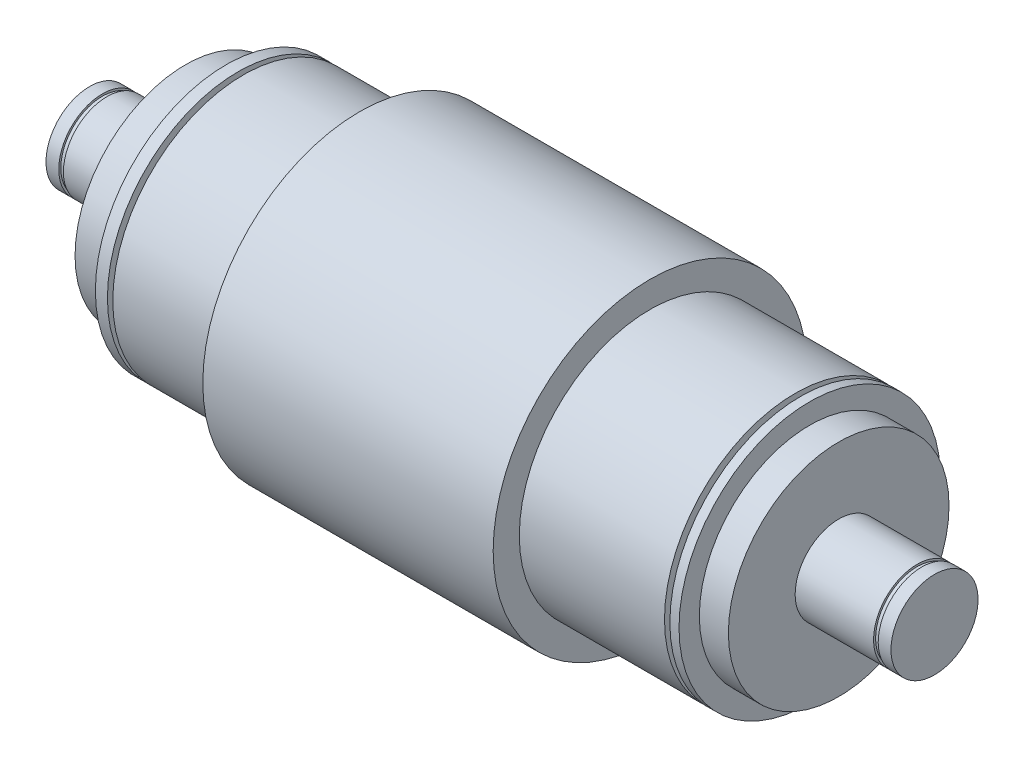
ISO-10303-21;
HEADER;
FILE_DESCRIPTION(('STEP AP214'),'2;1');
FILE_NAME('part.step','',(''),(''),'','','');
FILE_SCHEMA(('AUTOMOTIVE_DESIGN { 1 0 10303 214 1 1 1 1 }'));
ENDSEC;
DATA;
#1=APPLICATION_CONTEXT('core data for automotive mechanical design processes');
#2=APPLICATION_PROTOCOL_DEFINITION('international standard','automotive_design',2000,#1);
#3=PRODUCT_CONTEXT('',#1,'mechanical');
#4=PRODUCT('Part','Part','',(#3));
#5=PRODUCT_RELATED_PRODUCT_CATEGORY('part','',(#4));
#6=PRODUCT_DEFINITION_FORMATION('','',#4);
#7=PRODUCT_DEFINITION_CONTEXT('part definition',#1,'design');
#8=PRODUCT_DEFINITION('design','',#6,#7);
#9=PRODUCT_DEFINITION_SHAPE('','',#8);
#10=(LENGTH_UNIT() NAMED_UNIT(*) SI_UNIT(.MILLI.,.METRE.));
#11=(NAMED_UNIT(*) PLANE_ANGLE_UNIT() SI_UNIT($,.RADIAN.));
#12=(NAMED_UNIT(*) SI_UNIT($,.STERADIAN.) SOLID_ANGLE_UNIT());
#13=UNCERTAINTY_MEASURE_WITH_UNIT(LENGTH_MEASURE(1.E-05),#10,'distance_accuracy_value','');
#14=(GEOMETRIC_REPRESENTATION_CONTEXT(3) GLOBAL_UNCERTAINTY_ASSIGNED_CONTEXT((#13)) GLOBAL_UNIT_ASSIGNED_CONTEXT((#10,
#11,#12)) REPRESENTATION_CONTEXT('',''));
#15=CARTESIAN_POINT('',(0.,0.,0.));
#16=DIRECTION('',(0.,0.,1.));
#17=DIRECTION('',(1.,0.,0.));
#18=AXIS2_PLACEMENT_3D('',#15,#16,#17);
#19=CARTESIAN_POINT('',(0.,0.,0.));
#20=DIRECTION('',(-1.,0.,0.));
#21=DIRECTION('',(0.,0.,1.));
#22=AXIS2_PLACEMENT_3D('',#19,#20,#21);
#23=CYLINDRICAL_SURFACE('',#22,15.);
#24=CARTESIAN_POINT('',(33.,0.,0.));
#25=DIRECTION('',(-1.,0.,0.));
#26=DIRECTION('',(0.,0.,1.));
#27=AXIS2_PLACEMENT_3D('',#24,#25,#26);
#28=CIRCLE('',#27,15.);
#29=CARTESIAN_POINT('',(33.,0.,15.));
#30=VERTEX_POINT('',#29);
#31=EDGE_CURVE('E38',#30,#30,#28,.T.);
#32=ORIENTED_EDGE('',*,*,#31,.T.);
#33=EDGE_LOOP('',(#32));
#34=FACE_BOUND('',#33,.T.);
#35=CARTESIAN_POINT('',(6.,0.,0.));
#36=DIRECTION('',(-1.,0.,0.));
#37=DIRECTION('',(0.,0.,1.));
#38=AXIS2_PLACEMENT_3D('',#35,#36,#37);
#39=CIRCLE('',#38,15.);
#40=CARTESIAN_POINT('',(6.,0.,15.));
#41=VERTEX_POINT('',#40);
#42=EDGE_CURVE('E124',#41,#41,#39,.T.);
#43=ORIENTED_EDGE('',*,*,#42,.F.);
#44=EDGE_LOOP('',(#43));
#45=FACE_BOUND('',#44,.T.);
#46=ADVANCED_FACE('F31',(#34,#45),#23,.T.);
#47=CARTESIAN_POINT('',(0.,0.,0.));
#48=DIRECTION('',(-1.,0.,0.));
#49=DIRECTION('',(0.,0.,1.));
#50=AXIS2_PLACEMENT_3D('',#47,#48,#49);
#51=CYLINDRICAL_SURFACE('',#50,45.);
#52=CARTESIAN_POINT('',(47.,0.,0.));
#53=DIRECTION('',(-1.,0.,0.));
#54=DIRECTION('',(0.,0.,1.));
#55=AXIS2_PLACEMENT_3D('',#52,#53,#54);
#56=CIRCLE('',#55,45.);
#57=CARTESIAN_POINT('',(47.,0.,45.));
#58=VERTEX_POINT('',#57);
#59=EDGE_CURVE('E51',#58,#58,#56,.T.);
#60=ORIENTED_EDGE('',*,*,#59,.F.);
#61=EDGE_LOOP('',(#60));
#62=FACE_BOUND('',#61,.T.);
#63=CARTESIAN_POINT('',(51.15,0.,0.));
#64=DIRECTION('',(-1.,0.,0.));
#65=DIRECTION('',(0.,0.,1.));
#66=AXIS2_PLACEMENT_3D('',#63,#64,#65);
#67=CIRCLE('',#66,45.);
#68=CARTESIAN_POINT('',(51.15,0.,45.));
#69=VERTEX_POINT('',#68);
#70=EDGE_CURVE('E98',#69,#69,#67,.T.);
#71=ORIENTED_EDGE('',*,*,#70,.T.);
#72=EDGE_LOOP('',(#71));
#73=FACE_BOUND('',#72,.T.);
#74=ADVANCED_FACE('F149',(#62,#73),#51,.T.);
#75=CARTESIAN_POINT('',(33.,15.,0.));
#76=DIRECTION('',(1.,0.,0.));
#77=DIRECTION('',(0.,0.,-1.));
#78=AXIS2_PLACEMENT_3D('',#75,#76,#77);
#79=PLANE('',#78);
#80=ORIENTED_EDGE('',*,*,#31,.F.);
#81=EDGE_LOOP('',(#80));
#82=FACE_BOUND('',#81,.T.);
#83=CARTESIAN_POINT('',(33.,0.,0.));
#84=DIRECTION('',(-1.,0.,0.));
#85=DIRECTION('',(0.,0.,1.));
#86=AXIS2_PLACEMENT_3D('',#83,#84,#85);
#87=CIRCLE('',#86,38.);
#88=CARTESIAN_POINT('',(33.,0.,38.));
#89=VERTEX_POINT('',#88);
#90=EDGE_CURVE('E42',#89,#89,#87,.T.);
#91=ORIENTED_EDGE('',*,*,#90,.T.);
#92=EDGE_LOOP('',(#91));
#93=FACE_BOUND('',#92,.T.);
#94=ADVANCED_FACE('F153',(#82,#93),#79,.F.);
#95=CARTESIAN_POINT('',(0.,0.,0.));
#96=DIRECTION('',(-1.,0.,0.));
#97=DIRECTION('',(0.,0.,1.));
#98=AXIS2_PLACEMENT_3D('',#95,#96,#97);
#99=CYLINDRICAL_SURFACE('',#98,38.);
#100=ORIENTED_EDGE('',*,*,#90,.F.);
#101=EDGE_LOOP('',(#100));
#102=FACE_BOUND('',#101,.T.);
#103=CARTESIAN_POINT('',(47.,0.,0.));
#104=DIRECTION('',(-1.,0.,0.));
#105=DIRECTION('',(0.,0.,1.));
#106=AXIS2_PLACEMENT_3D('',#103,#104,#105);
#107=CIRCLE('',#106,38.);
#108=CARTESIAN_POINT('',(47.,0.,38.));
#109=VERTEX_POINT('',#108);
#110=EDGE_CURVE('E46',#109,#109,#107,.T.);
#111=ORIENTED_EDGE('',*,*,#110,.T.);
#112=EDGE_LOOP('',(#111));
#113=FACE_BOUND('',#112,.T.);
#114=ADVANCED_FACE('F316',(#102,#113),#99,.T.);
#115=CARTESIAN_POINT('',(47.,38.,0.));
#116=DIRECTION('',(1.,0.,0.));
#117=DIRECTION('',(0.,0.,-1.));
#118=AXIS2_PLACEMENT_3D('',#115,#116,#117);
#119=PLANE('',#118);
#120=ORIENTED_EDGE('',*,*,#110,.F.);
#121=EDGE_LOOP('',(#120));
#122=FACE_BOUND('',#121,.T.);
#123=ORIENTED_EDGE('',*,*,#59,.T.);
#124=EDGE_LOOP('',(#123));
#125=FACE_BOUND('',#124,.T.);
#126=ADVANCED_FACE('F213',(#122,#125),#119,.F.);
#127=CARTESIAN_POINT('',(51.15,45.,0.));
#128=DIRECTION('',(1.,0.,0.));
#129=DIRECTION('',(0.,0.,-1.));
#130=AXIS2_PLACEMENT_3D('',#127,#128,#129);
#131=PLANE('',#130);
#132=CARTESIAN_POINT('',(51.15,0.,0.));
#133=DIRECTION('',(-1.,0.,0.));
#134=DIRECTION('',(0.,0.,1.));
#135=AXIS2_PLACEMENT_3D('',#132,#133,#134);
#136=CIRCLE('',#135,21.25);
#137=CARTESIAN_POINT('',(51.15,0.,21.25));
#138=VERTEX_POINT('',#137);
#139=EDGE_CURVE('E107',#138,#138,#136,.T.);
#140=ORIENTED_EDGE('',*,*,#139,.T.);
#141=EDGE_LOOP('',(#140));
#142=FACE_BOUND('',#141,.T.);
#143=ORIENTED_EDGE('',*,*,#70,.F.);
#144=EDGE_LOOP('',(#143));
#145=FACE_BOUND('',#144,.T.);
#146=ADVANCED_FACE('F203',(#142,#145),#131,.T.);
#147=CARTESIAN_POINT('',(0.,0.,0.));
#148=DIRECTION('',(-1.,0.,0.));
#149=DIRECTION('',(0.,0.,1.));
#150=AXIS2_PLACEMENT_3D('',#147,#148,#149);
#151=CYLINDRICAL_SURFACE('',#150,21.25);
#152=CARTESIAN_POINT('',(53.,0.,0.));
#153=DIRECTION('',(-1.,0.,0.));
#154=DIRECTION('',(0.,0.,1.));
#155=AXIS2_PLACEMENT_3D('',#152,#153,#154);
#156=CIRCLE('',#155,21.25);
#157=CARTESIAN_POINT('',(53.,0.,21.25));
#158=VERTEX_POINT('',#157);
#159=EDGE_CURVE('E111',#158,#158,#156,.T.);
#160=ORIENTED_EDGE('',*,*,#159,.T.);
#161=EDGE_LOOP('',(#160));
#162=FACE_BOUND('',#161,.T.);
#163=ORIENTED_EDGE('',*,*,#139,.F.);
#164=EDGE_LOOP('',(#163));
#165=FACE_BOUND('',#164,.T.);
#166=ADVANCED_FACE('F145',(#162,#165),#151,.T.);
#167=CARTESIAN_POINT('',(53.,45.,0.));
#168=DIRECTION('',(-1.,0.,0.));
#169=DIRECTION('',(0.,0.,1.));
#170=AXIS2_PLACEMENT_3D('',#167,#168,#169);
#171=PLANE('',#170);
#172=CARTESIAN_POINT('',(53.,0.,0.));
#173=DIRECTION('',(-1.,0.,0.));
#174=DIRECTION('',(0.,0.,1.));
#175=AXIS2_PLACEMENT_3D('',#172,#173,#174);
#176=CIRCLE('',#175,45.);
#177=CARTESIAN_POINT('',(53.,0.,45.));
#178=VERTEX_POINT('',#177);
#179=EDGE_CURVE('E114',#178,#178,#176,.T.);
#180=ORIENTED_EDGE('',*,*,#179,.T.);
#181=EDGE_LOOP('',(#180));
#182=FACE_BOUND('',#181,.T.);
#183=ORIENTED_EDGE('',*,*,#159,.F.);
#184=EDGE_LOOP('',(#183));
#185=FACE_BOUND('',#184,.T.);
#186=ADVANCED_FACE('F135',(#182,#185),#171,.T.);
#187=CARTESIAN_POINT('',(4.4,15.,0.));
#188=DIRECTION('',(1.,0.,0.));
#189=DIRECTION('',(0.,0.,-1.));
#190=AXIS2_PLACEMENT_3D('',#187,#188,#189);
#191=PLANE('',#190);
#192=CARTESIAN_POINT('',(4.4,0.,0.));
#193=DIRECTION('',(-1.,0.,0.));
#194=DIRECTION('',(0.,0.,1.));
#195=AXIS2_PLACEMENT_3D('',#192,#193,#194);
#196=CIRCLE('',#195,14.3);
#197=CARTESIAN_POINT('',(4.4,0.,14.3));
#198=VERTEX_POINT('',#197);
#199=EDGE_CURVE('E81',#198,#198,#196,.T.);
#200=ORIENTED_EDGE('',*,*,#199,.T.);
#201=EDGE_LOOP('',(#200));
#202=FACE_BOUND('',#201,.T.);
#203=CARTESIAN_POINT('',(4.4,0.,0.));
#204=DIRECTION('',(-1.,0.,0.));
#205=DIRECTION('',(0.,0.,1.));
#206=AXIS2_PLACEMENT_3D('',#203,#204,#205);
#207=CIRCLE('',#206,15.);
#208=CARTESIAN_POINT('',(4.4,0.,15.));
#209=VERTEX_POINT('',#208);
#210=EDGE_CURVE('E110',#209,#209,#207,.T.);
#211=ORIENTED_EDGE('',*,*,#210,.F.);
#212=EDGE_LOOP('',(#211));
#213=FACE_BOUND('',#212,.T.);
#214=ADVANCED_FACE('F132',(#202,#213),#191,.T.);
#215=CARTESIAN_POINT('',(0.,0.,0.));
#216=DIRECTION('',(-1.,0.,0.));
#217=DIRECTION('',(0.,0.,1.));
#218=AXIS2_PLACEMENT_3D('',#215,#216,#217);
#219=CYLINDRICAL_SURFACE('',#218,14.3);
#220=CARTESIAN_POINT('',(6.,0.,0.));
#221=DIRECTION('',(-1.,0.,0.));
#222=DIRECTION('',(0.,0.,1.));
#223=AXIS2_PLACEMENT_3D('',#220,#221,#222);
#224=CIRCLE('',#223,14.3);
#225=CARTESIAN_POINT('',(6.,0.,14.3));
#226=VERTEX_POINT('',#225);
#227=EDGE_CURVE('E121',#226,#226,#224,.T.);
#228=ORIENTED_EDGE('',*,*,#227,.T.);
#229=EDGE_LOOP('',(#228));
#230=FACE_BOUND('',#229,.T.);
#231=ORIENTED_EDGE('',*,*,#199,.F.);
#232=EDGE_LOOP('',(#231));
#233=FACE_BOUND('',#232,.T.);
#234=ADVANCED_FACE('F134',(#230,#233),#219,.T.);
#235=CARTESIAN_POINT('',(6.,15.,0.));
#236=DIRECTION('',(-1.,0.,0.));
#237=DIRECTION('',(0.,0.,1.));
#238=AXIS2_PLACEMENT_3D('',#235,#236,#237);
#239=PLANE('',#238);
#240=ORIENTED_EDGE('',*,*,#42,.T.);
#241=EDGE_LOOP('',(#240));
#242=FACE_BOUND('',#241,.T.);
#243=ORIENTED_EDGE('',*,*,#227,.F.);
#244=EDGE_LOOP('',(#243));
#245=FACE_BOUND('',#244,.T.);
#246=ADVANCED_FACE('F142',(#242,#245),#239,.T.);
#247=CARTESIAN_POINT('',(0.,0.,0.));
#248=DIRECTION('',(1.,0.,0.));
#249=DIRECTION('',(0.,0.,-1.));
#250=AXIS2_PLACEMENT_3D('',#247,#248,#249);
#251=PLANE('',#250);
#252=CARTESIAN_POINT('',(0.,0.,0.));
#253=DIRECTION('',(-1.,0.,0.));
#254=DIRECTION('',(0.,0.,1.));
#255=AXIS2_PLACEMENT_3D('',#252,#253,#254);
#256=CIRCLE('',#255,15.);
#257=CARTESIAN_POINT('',(0.,0.,15.));
#258=VERTEX_POINT('',#257);
#259=EDGE_CURVE('E10',#258,#258,#256,.T.);
#260=ORIENTED_EDGE('',*,*,#259,.T.);
#261=EDGE_LOOP('',(#260));
#262=FACE_BOUND('',#261,.T.);
#263=ADVANCED_FACE('F33',(#262),#251,.F.);
#264=ORIENTED_EDGE('',*,*,#259,.F.);
#265=EDGE_LOOP('',(#264));
#266=FACE_BOUND('',#265,.T.);
#267=ORIENTED_EDGE('',*,*,#210,.T.);
#268=EDGE_LOOP('',(#267));
#269=FACE_BOUND('',#268,.T.);
#270=ADVANCED_FACE('F130',(#266,#269),#23,.T.);
#271=CARTESIAN_POINT('',(93.,45.,0.));
#272=DIRECTION('',(1.,0.,0.));
#273=DIRECTION('',(0.,0.,-1.));
#274=AXIS2_PLACEMENT_3D('',#271,#272,#273);
#275=PLANE('',#274);
#276=CARTESIAN_POINT('',(93.,0.,0.));
#277=DIRECTION('',(-1.,0.,0.));
#278=DIRECTION('',(0.,0.,1.));
#279=AXIS2_PLACEMENT_3D('',#276,#277,#278);
#280=CIRCLE('',#279,45.);
#281=CARTESIAN_POINT('',(93.,0.,45.));
#282=VERTEX_POINT('',#281);
#283=EDGE_CURVE('E54',#282,#282,#280,.T.);
#284=ORIENTED_EDGE('',*,*,#283,.F.);
#285=EDGE_LOOP('',(#284));
#286=FACE_BOUND('',#285,.T.);
#287=CARTESIAN_POINT('',(93.,0.,0.));
#288=DIRECTION('',(-1.,0.,0.));
#289=DIRECTION('',(0.,0.,1.));
#290=AXIS2_PLACEMENT_3D('',#287,#288,#289);
#291=CIRCLE('',#290,54.);
#292=CARTESIAN_POINT('',(93.,0.,54.));
#293=VERTEX_POINT('',#292);
#294=EDGE_CURVE('E57',#293,#293,#291,.T.);
#295=ORIENTED_EDGE('',*,*,#294,.T.);
#296=EDGE_LOOP('',(#295));
#297=FACE_BOUND('',#296,.T.);
#298=ADVANCED_FACE('F160',(#286,#297),#275,.F.);
#299=ORIENTED_EDGE('',*,*,#283,.T.);
#300=EDGE_LOOP('',(#299));
#301=FACE_BOUND('',#300,.T.);
#302=ORIENTED_EDGE('',*,*,#179,.F.);
#303=EDGE_LOOP('',(#302));
#304=FACE_BOUND('',#303,.T.);
#305=ADVANCED_FACE('F156',(#301,#304),#51,.T.);
#306=CARTESIAN_POINT('',(0.,0.,0.));
#307=DIRECTION('',(-1.,0.,0.));
#308=DIRECTION('',(0.,0.,1.));
#309=AXIS2_PLACEMENT_3D('',#306,#307,#308);
#310=CYLINDRICAL_SURFACE('',#309,54.);
#311=ORIENTED_EDGE('',*,*,#294,.F.);
#312=EDGE_LOOP('',(#311));
#313=FACE_BOUND('',#312,.T.);
#314=CARTESIAN_POINT('',(193.,0.,0.));
#315=DIRECTION('',(-1.,0.,0.));
#316=DIRECTION('',(0.,0.,1.));
#317=AXIS2_PLACEMENT_3D('',#314,#315,#316);
#318=CIRCLE('',#317,54.);
#319=CARTESIAN_POINT('',(193.,0.,54.));
#320=VERTEX_POINT('',#319);
#321=EDGE_CURVE('E60',#320,#320,#318,.T.);
#322=ORIENTED_EDGE('',*,*,#321,.T.);
#323=EDGE_LOOP('',(#322));
#324=FACE_BOUND('',#323,.T.);
#325=ADVANCED_FACE('F290',(#313,#324),#310,.T.);
#326=CARTESIAN_POINT('',(193.,54.,0.));
#327=DIRECTION('',(-1.,0.,0.));
#328=DIRECTION('',(0.,0.,1.));
#329=AXIS2_PLACEMENT_3D('',#326,#327,#328);
#330=PLANE('',#329);
#331=ORIENTED_EDGE('',*,*,#321,.F.);
#332=EDGE_LOOP('',(#331));
#333=FACE_BOUND('',#332,.T.);
#334=CARTESIAN_POINT('',(193.,0.,0.));
#335=DIRECTION('',(-1.,0.,0.));
#336=DIRECTION('',(0.,0.,1.));
#337=AXIS2_PLACEMENT_3D('',#334,#335,#336);
#338=CIRCLE('',#337,45.);
#339=CARTESIAN_POINT('',(193.,0.,45.));
#340=VERTEX_POINT('',#339);
#341=EDGE_CURVE('E63',#340,#340,#338,.T.);
#342=ORIENTED_EDGE('',*,*,#341,.T.);
#343=EDGE_LOOP('',(#342));
#344=FACE_BOUND('',#343,.T.);
#345=ADVANCED_FACE('F285',(#333,#344),#330,.F.);
#346=CARTESIAN_POINT('',(0.,0.,0.));
#347=DIRECTION('',(-1.,0.,0.));
#348=DIRECTION('',(0.,0.,1.));
#349=AXIS2_PLACEMENT_3D('',#346,#347,#348);
#350=CYLINDRICAL_SURFACE('',#349,45.);
#351=ORIENTED_EDGE('',*,*,#341,.F.);
#352=EDGE_LOOP('',(#351));
#353=FACE_BOUND('',#352,.T.);
#354=CARTESIAN_POINT('',(243.,0.,0.));
#355=DIRECTION('',(-1.,0.,0.));
#356=DIRECTION('',(0.,0.,1.));
#357=AXIS2_PLACEMENT_3D('',#354,#355,#356);
#358=CIRCLE('',#357,45.);
#359=CARTESIAN_POINT('',(243.,0.,45.));
#360=VERTEX_POINT('',#359);
#361=EDGE_CURVE('E85',#360,#360,#358,.T.);
#362=ORIENTED_EDGE('',*,*,#361,.T.);
#363=EDGE_LOOP('',(#362));
#364=FACE_BOUND('',#363,.T.);
#365=ADVANCED_FACE('F289',(#353,#364),#350,.T.);
#366=CARTESIAN_POINT('',(243.,45.,0.));
#367=DIRECTION('',(1.,0.,0.));
#368=DIRECTION('',(0.,0.,-1.));
#369=AXIS2_PLACEMENT_3D('',#366,#367,#368);
#370=PLANE('',#369);
#371=CARTESIAN_POINT('',(243.,0.,0.));
#372=DIRECTION('',(-1.,0.,0.));
#373=DIRECTION('',(0.,0.,1.));
#374=AXIS2_PLACEMENT_3D('',#371,#372,#373);
#375=CIRCLE('',#374,21.25);
#376=CARTESIAN_POINT('',(243.,0.,21.25));
#377=VERTEX_POINT('',#376);
#378=EDGE_CURVE('E95',#377,#377,#375,.T.);
#379=ORIENTED_EDGE('',*,*,#378,.T.);
#380=EDGE_LOOP('',(#379));
#381=FACE_BOUND('',#380,.T.);
#382=ORIENTED_EDGE('',*,*,#361,.F.);
#383=EDGE_LOOP('',(#382));
#384=FACE_BOUND('',#383,.T.);
#385=ADVANCED_FACE('F343',(#381,#384),#370,.T.);
#386=CARTESIAN_POINT('',(0.,0.,0.));
#387=DIRECTION('',(-1.,0.,0.));
#388=DIRECTION('',(0.,0.,1.));
#389=AXIS2_PLACEMENT_3D('',#386,#387,#388);
#390=CYLINDRICAL_SURFACE('',#389,21.25);
#391=CARTESIAN_POINT('',(244.85,0.,0.));
#392=DIRECTION('',(-1.,0.,0.));
#393=DIRECTION('',(0.,0.,1.));
#394=AXIS2_PLACEMENT_3D('',#391,#392,#393);
#395=CIRCLE('',#394,21.25);
#396=CARTESIAN_POINT('',(244.85,0.,21.25));
#397=VERTEX_POINT('',#396);
#398=EDGE_CURVE('E99',#397,#397,#395,.T.);
#399=ORIENTED_EDGE('',*,*,#398,.T.);
#400=EDGE_LOOP('',(#399));
#401=FACE_BOUND('',#400,.T.);
#402=ORIENTED_EDGE('',*,*,#378,.F.);
#403=EDGE_LOOP('',(#402));
#404=FACE_BOUND('',#403,.T.);
#405=ADVANCED_FACE('F360',(#401,#404),#390,.T.);
#406=CARTESIAN_POINT('',(244.85,45.,0.));
#407=DIRECTION('',(-1.,0.,0.));
#408=DIRECTION('',(0.,0.,1.));
#409=AXIS2_PLACEMENT_3D('',#406,#407,#408);
#410=PLANE('',#409);
#411=CARTESIAN_POINT('',(244.85,0.,0.));
#412=DIRECTION('',(-1.,0.,0.));
#413=DIRECTION('',(0.,0.,1.));
#414=AXIS2_PLACEMENT_3D('',#411,#412,#413);
#415=CIRCLE('',#414,45.);
#416=CARTESIAN_POINT('',(244.85,0.,45.));
#417=VERTEX_POINT('',#416);
#418=EDGE_CURVE('E102',#417,#417,#415,.T.);
#419=ORIENTED_EDGE('',*,*,#418,.T.);
#420=EDGE_LOOP('',(#419));
#421=FACE_BOUND('',#420,.T.);
#422=ORIENTED_EDGE('',*,*,#398,.F.);
#423=EDGE_LOOP('',(#422));
#424=FACE_BOUND('',#423,.T.);
#425=ADVANCED_FACE('F277',(#421,#424),#410,.T.);
#426=CARTESIAN_POINT('',(248.,45.,0.));
#427=DIRECTION('',(-1.,0.,0.));
#428=DIRECTION('',(0.,0.,1.));
#429=AXIS2_PLACEMENT_3D('',#426,#427,#428);
#430=PLANE('',#429);
#431=CARTESIAN_POINT('',(248.,0.,0.));
#432=DIRECTION('',(-1.,0.,0.));
#433=DIRECTION('',(0.,0.,1.));
#434=AXIS2_PLACEMENT_3D('',#431,#432,#433);
#435=CIRCLE('',#434,45.);
#436=CARTESIAN_POINT('',(248.,0.,45.));
#437=VERTEX_POINT('',#436);
#438=EDGE_CURVE('E66',#437,#437,#435,.T.);
#439=ORIENTED_EDGE('',*,*,#438,.F.);
#440=EDGE_LOOP('',(#439));
#441=FACE_BOUND('',#440,.T.);
#442=CARTESIAN_POINT('',(248.,0.,0.));
#443=DIRECTION('',(-1.,0.,0.));
#444=DIRECTION('',(0.,0.,1.));
#445=AXIS2_PLACEMENT_3D('',#442,#443,#444);
#446=CIRCLE('',#445,38.);
#447=CARTESIAN_POINT('',(248.,0.,38.));
#448=VERTEX_POINT('',#447);
#449=EDGE_CURVE('E69',#448,#448,#446,.T.);
#450=ORIENTED_EDGE('',*,*,#449,.T.);
#451=EDGE_LOOP('',(#450));
#452=FACE_BOUND('',#451,.T.);
#453=ADVANCED_FACE('F273',(#441,#452),#430,.F.);
#454=ORIENTED_EDGE('',*,*,#438,.T.);
#455=EDGE_LOOP('',(#454));
#456=FACE_BOUND('',#455,.T.);
#457=ORIENTED_EDGE('',*,*,#418,.F.);
#458=EDGE_LOOP('',(#457));
#459=FACE_BOUND('',#458,.T.);
#460=ADVANCED_FACE('F265',(#456,#459),#350,.T.);
#461=CARTESIAN_POINT('',(0.,0.,0.));
#462=DIRECTION('',(-1.,0.,0.));
#463=DIRECTION('',(0.,0.,1.));
#464=AXIS2_PLACEMENT_3D('',#461,#462,#463);
#465=CYLINDRICAL_SURFACE('',#464,38.);
#466=ORIENTED_EDGE('',*,*,#449,.F.);
#467=EDGE_LOOP('',(#466));
#468=FACE_BOUND('',#467,.T.);
#469=CARTESIAN_POINT('',(258.,0.,0.));
#470=DIRECTION('',(-1.,0.,0.));
#471=DIRECTION('',(0.,0.,1.));
#472=AXIS2_PLACEMENT_3D('',#469,#470,#471);
#473=CIRCLE('',#472,38.);
#474=CARTESIAN_POINT('',(258.,0.,38.));
#475=VERTEX_POINT('',#474);
#476=EDGE_CURVE('E72',#475,#475,#473,.T.);
#477=ORIENTED_EDGE('',*,*,#476,.T.);
#478=EDGE_LOOP('',(#477));
#479=FACE_BOUND('',#478,.T.);
#480=ADVANCED_FACE('F254',(#468,#479),#465,.T.);
#481=CARTESIAN_POINT('',(258.,38.,0.));
#482=DIRECTION('',(-1.,0.,0.));
#483=DIRECTION('',(0.,0.,1.));
#484=AXIS2_PLACEMENT_3D('',#481,#482,#483);
#485=PLANE('',#484);
#486=ORIENTED_EDGE('',*,*,#476,.F.);
#487=EDGE_LOOP('',(#486));
#488=FACE_BOUND('',#487,.T.);
#489=CARTESIAN_POINT('',(258.,0.,0.));
#490=DIRECTION('',(-1.,0.,0.));
#491=DIRECTION('',(0.,0.,1.));
#492=AXIS2_PLACEMENT_3D('',#489,#490,#491);
#493=CIRCLE('',#492,15.);
#494=CARTESIAN_POINT('',(258.,0.,15.));
#495=VERTEX_POINT('',#494);
#496=EDGE_CURVE('E75',#495,#495,#493,.T.);
#497=ORIENTED_EDGE('',*,*,#496,.T.);
#498=EDGE_LOOP('',(#497));
#499=FACE_BOUND('',#498,.T.);
#500=ADVANCED_FACE('F249',(#488,#499),#485,.F.);
#501=CARTESIAN_POINT('',(0.,0.,0.));
#502=DIRECTION('',(-1.,0.,0.));
#503=DIRECTION('',(0.,0.,1.));
#504=AXIS2_PLACEMENT_3D('',#501,#502,#503);
#505=CYLINDRICAL_SURFACE('',#504,15.);
#506=ORIENTED_EDGE('',*,*,#496,.F.);
#507=EDGE_LOOP('',(#506));
#508=FACE_BOUND('',#507,.T.);
#509=CARTESIAN_POINT('',(285.,0.,0.));
#510=DIRECTION('',(-1.,0.,0.));
#511=DIRECTION('',(0.,0.,1.));
#512=AXIS2_PLACEMENT_3D('',#509,#510,#511);
#513=CIRCLE('',#512,15.);
#514=CARTESIAN_POINT('',(285.,0.,15.));
#515=VERTEX_POINT('',#514);
#516=EDGE_CURVE('E92',#515,#515,#513,.T.);
#517=ORIENTED_EDGE('',*,*,#516,.T.);
#518=EDGE_LOOP('',(#517));
#519=FACE_BOUND('',#518,.T.);
#520=ADVANCED_FACE('F253',(#508,#519),#505,.T.);
#521=CARTESIAN_POINT('',(285.,15.,0.));
#522=DIRECTION('',(1.,0.,0.));
#523=DIRECTION('',(0.,0.,-1.));
#524=AXIS2_PLACEMENT_3D('',#521,#522,#523);
#525=PLANE('',#524);
#526=CARTESIAN_POINT('',(285.,0.,0.));
#527=DIRECTION('',(-1.,0.,0.));
#528=DIRECTION('',(0.,0.,1.));
#529=AXIS2_PLACEMENT_3D('',#526,#527,#528);
#530=CIRCLE('',#529,14.3);
#531=CARTESIAN_POINT('',(285.,0.,14.3));
#532=VERTEX_POINT('',#531);
#533=EDGE_CURVE('E82',#532,#532,#530,.T.);
#534=ORIENTED_EDGE('',*,*,#533,.T.);
#535=EDGE_LOOP('',(#534));
#536=FACE_BOUND('',#535,.T.);
#537=ORIENTED_EDGE('',*,*,#516,.F.);
#538=EDGE_LOOP('',(#537));
#539=FACE_BOUND('',#538,.T.);
#540=ADVANCED_FACE('F346',(#536,#539),#525,.T.);
#541=CARTESIAN_POINT('',(0.,0.,0.));
#542=DIRECTION('',(-1.,0.,0.));
#543=DIRECTION('',(0.,0.,1.));
#544=AXIS2_PLACEMENT_3D('',#541,#542,#543);
#545=CYLINDRICAL_SURFACE('',#544,14.3);
#546=CARTESIAN_POINT('',(286.6,0.,0.));
#547=DIRECTION('',(-1.,0.,0.));
#548=DIRECTION('',(0.,0.,1.));
#549=AXIS2_PLACEMENT_3D('',#546,#547,#548);
#550=CIRCLE('',#549,14.3);
#551=CARTESIAN_POINT('',(286.6,0.,14.3));
#552=VERTEX_POINT('',#551);
#553=EDGE_CURVE('E86',#552,#552,#550,.T.);
#554=ORIENTED_EDGE('',*,*,#553,.T.);
#555=EDGE_LOOP('',(#554));
#556=FACE_BOUND('',#555,.T.);
#557=ORIENTED_EDGE('',*,*,#533,.F.);
#558=EDGE_LOOP('',(#557));
#559=FACE_BOUND('',#558,.T.);
#560=ADVANCED_FACE('F351',(#556,#559),#545,.T.);
#561=CARTESIAN_POINT('',(286.6,15.,0.));
#562=DIRECTION('',(-1.,0.,0.));
#563=DIRECTION('',(0.,0.,1.));
#564=AXIS2_PLACEMENT_3D('',#561,#562,#563);
#565=PLANE('',#564);
#566=CARTESIAN_POINT('',(286.6,0.,0.));
#567=DIRECTION('',(-1.,0.,0.));
#568=DIRECTION('',(0.,0.,1.));
#569=AXIS2_PLACEMENT_3D('',#566,#567,#568);
#570=CIRCLE('',#569,15.);
#571=CARTESIAN_POINT('',(286.6,0.,15.));
#572=VERTEX_POINT('',#571);
#573=EDGE_CURVE('E89',#572,#572,#570,.T.);
#574=ORIENTED_EDGE('',*,*,#573,.T.);
#575=EDGE_LOOP('',(#574));
#576=FACE_BOUND('',#575,.T.);
#577=ORIENTED_EDGE('',*,*,#553,.F.);
#578=EDGE_LOOP('',(#577));
#579=FACE_BOUND('',#578,.T.);
#580=ADVANCED_FACE('F239',(#576,#579),#565,.T.);
#581=CARTESIAN_POINT('',(291.,15.,0.));
#582=DIRECTION('',(-1.,0.,0.));
#583=DIRECTION('',(0.,0.,1.));
#584=AXIS2_PLACEMENT_3D('',#581,#582,#583);
#585=PLANE('',#584);
#586=CARTESIAN_POINT('',(291.,0.,0.));
#587=DIRECTION('',(-1.,0.,0.));
#588=DIRECTION('',(0.,0.,1.));
#589=AXIS2_PLACEMENT_3D('',#586,#587,#588);
#590=CIRCLE('',#589,15.);
#591=CARTESIAN_POINT('',(291.,0.,15.));
#592=VERTEX_POINT('',#591);
#593=EDGE_CURVE('E78',#592,#592,#590,.T.);
#594=ORIENTED_EDGE('',*,*,#593,.F.);
#595=EDGE_LOOP('',(#594));
#596=FACE_BOUND('',#595,.T.);
#597=ADVANCED_FACE('F233',(#596),#585,.F.);
#598=ORIENTED_EDGE('',*,*,#593,.T.);
#599=EDGE_LOOP('',(#598));
#600=FACE_BOUND('',#599,.T.);
#601=ORIENTED_EDGE('',*,*,#573,.F.);
#602=EDGE_LOOP('',(#601));
#603=FACE_BOUND('',#602,.T.);
#604=ADVANCED_FACE('F238',(#600,#603),#505,.T.);
#605=CLOSED_SHELL('',(#46,#74,#94,#114,#126,#146,#166,#186,#214,#234,#246,#263,#270,#298,#305,
#325,#345,#365,#385,#405,#425,#453,#460,#480,#500,#520,#540,#560,#580,#597,#604));
#606=MANIFOLD_SOLID_BREP('B2',#605);
#607=ADVANCED_BREP_SHAPE_REPRESENTATION('',(#18,#606),#14);
#608=SHAPE_DEFINITION_REPRESENTATION(#9,#607);
ENDSEC;
END-ISO-10303-21;
